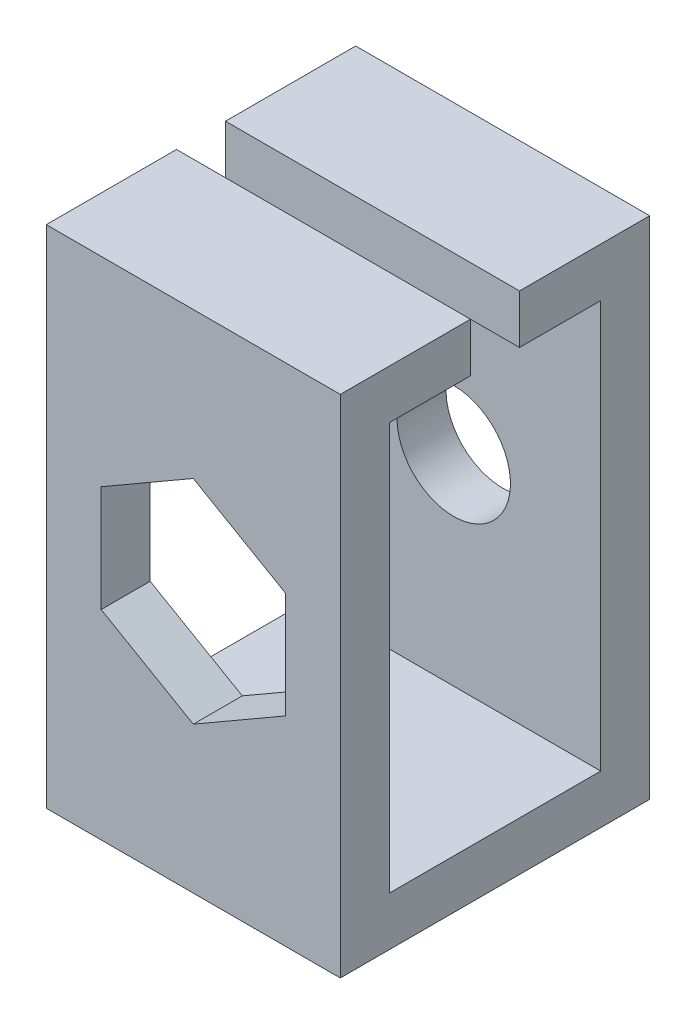
ISO-10303-21;
HEADER;
FILE_DESCRIPTION(('STEP AP214'),'2;1');
FILE_NAME('part.step','',(''),(''),'','','');
FILE_SCHEMA(('AUTOMOTIVE_DESIGN { 1 0 10303 214 1 1 1 1 }'));
ENDSEC;
DATA;
#1=APPLICATION_CONTEXT('core data for automotive mechanical design processes');
#2=APPLICATION_PROTOCOL_DEFINITION('international standard','automotive_design',2000,#1);
#3=PRODUCT_CONTEXT('',#1,'mechanical');
#4=PRODUCT('Part','Part','',(#3));
#5=PRODUCT_RELATED_PRODUCT_CATEGORY('part','',(#4));
#6=PRODUCT_DEFINITION_FORMATION('','',#4);
#7=PRODUCT_DEFINITION_CONTEXT('part definition',#1,'design');
#8=PRODUCT_DEFINITION('design','',#6,#7);
#9=PRODUCT_DEFINITION_SHAPE('','',#8);
#10=(LENGTH_UNIT() NAMED_UNIT(*) SI_UNIT(.MILLI.,.METRE.));
#11=(NAMED_UNIT(*) PLANE_ANGLE_UNIT() SI_UNIT($,.RADIAN.));
#12=(NAMED_UNIT(*) SI_UNIT($,.STERADIAN.) SOLID_ANGLE_UNIT());
#13=UNCERTAINTY_MEASURE_WITH_UNIT(LENGTH_MEASURE(1.E-05),#10,'distance_accuracy_value','');
#14=(GEOMETRIC_REPRESENTATION_CONTEXT(3) GLOBAL_UNCERTAINTY_ASSIGNED_CONTEXT((#13)) GLOBAL_UNIT_ASSIGNED_CONTEXT((#10,
#11,#12)) REPRESENTATION_CONTEXT('',''));
#15=CARTESIAN_POINT('',(0.,0.,0.));
#16=DIRECTION('',(0.,0.,1.));
#17=DIRECTION('',(1.,0.,0.));
#18=AXIS2_PLACEMENT_3D('',#15,#16,#17);
#19=CARTESIAN_POINT('',(9.525,13.2,6.85000000000001));
#20=DIRECTION('',(0.,1.,0.));
#21=DIRECTION('',(0.,0.,1.));
#22=AXIS2_PLACEMENT_3D('',#19,#20,#21);
#23=PLANE('',#22);
#24=DIRECTION('',(0.,0.,-1.));
#25=VECTOR('',#24,1.);
#26=CARTESIAN_POINT('',(-9.525,13.2,6.85000000000001));
#27=LINE('',#26,#25);
#28=CARTESIAN_POINT('',(-9.525,13.2,6.85000000000001));
#29=VERTEX_POINT('',#28);
#30=CARTESIAN_POINT('',(-9.525,13.2,1.5875));
#31=VERTEX_POINT('',#30);
#32=EDGE_CURVE('E209',#29,#31,#27,.T.);
#33=ORIENTED_EDGE('',*,*,#32,.T.);
#34=DIRECTION('',(-1.,0.,0.));
#35=VECTOR('',#34,1.);
#36=CARTESIAN_POINT('',(9.525,13.2,1.5875));
#37=LINE('',#36,#35);
#38=CARTESIAN_POINT('',(9.525,13.2,1.5875));
#39=VERTEX_POINT('',#38);
#40=EDGE_CURVE('E11',#39,#31,#37,.T.);
#41=ORIENTED_EDGE('',*,*,#40,.F.);
#42=DIRECTION('',(0.,0.,-1.));
#43=VECTOR('',#42,1.);
#44=CARTESIAN_POINT('',(9.525,13.2,6.85000000000001));
#45=LINE('',#44,#43);
#46=CARTESIAN_POINT('',(9.525,13.2,6.85000000000001));
#47=VERTEX_POINT('',#46);
#48=EDGE_CURVE('E210',#47,#39,#45,.T.);
#49=ORIENTED_EDGE('',*,*,#48,.F.);
#50=DIRECTION('',(-1.,0.,0.));
#51=VECTOR('',#50,1.);
#52=CARTESIAN_POINT('',(9.525,13.2,6.85000000000001));
#53=LINE('',#52,#51);
#54=EDGE_CURVE('E236',#47,#29,#53,.T.);
#55=ORIENTED_EDGE('',*,*,#54,.T.);
#56=EDGE_LOOP('',(#33,#41,#49,#55));
#57=FACE_BOUND('',#56,.T.);
#58=ADVANCED_FACE('F37',(#57),#23,.F.);
#59=CARTESIAN_POINT('',(9.525,13.2,1.5875));
#60=DIRECTION('',(0.,0.,1.));
#61=DIRECTION('',(0.,-1.,0.));
#62=AXIS2_PLACEMENT_3D('',#59,#60,#61);
#63=PLANE('',#62);
#64=DIRECTION('',(0.,1.,0.));
#65=VECTOR('',#64,1.);
#66=CARTESIAN_POINT('',(-9.525,13.2,1.5875));
#67=LINE('',#66,#65);
#68=CARTESIAN_POINT('',(-9.525,16.375,1.5875));
#69=VERTEX_POINT('',#68);
#70=EDGE_CURVE('E239',#31,#69,#67,.T.);
#71=ORIENTED_EDGE('',*,*,#70,.T.);
#72=DIRECTION('',(-1.,0.,0.));
#73=VECTOR('',#72,1.);
#74=CARTESIAN_POINT('',(9.525,16.375,1.5875));
#75=LINE('',#74,#73);
#76=CARTESIAN_POINT('',(9.525,16.375,1.5875));
#77=VERTEX_POINT('',#76);
#78=EDGE_CURVE('E44',#77,#69,#75,.T.);
#79=ORIENTED_EDGE('',*,*,#78,.F.);
#80=DIRECTION('',(0.,1.,0.));
#81=VECTOR('',#80,1.);
#82=CARTESIAN_POINT('',(9.525,13.2,1.5875));
#83=LINE('',#82,#81);
#84=EDGE_CURVE('E213',#39,#77,#83,.T.);
#85=ORIENTED_EDGE('',*,*,#84,.F.);
#86=ORIENTED_EDGE('',*,*,#40,.T.);
#87=EDGE_LOOP('',(#71,#79,#85,#86));
#88=FACE_BOUND('',#87,.T.);
#89=ADVANCED_FACE('F314',(#88),#63,.F.);
#90=CARTESIAN_POINT('',(9.525,16.375,1.5875));
#91=DIRECTION('',(0.,-1.,0.));
#92=DIRECTION('',(0.,0.,-1.));
#93=AXIS2_PLACEMENT_3D('',#90,#91,#92);
#94=PLANE('',#93);
#95=DIRECTION('',(0.,0.,1.));
#96=VECTOR('',#95,1.);
#97=CARTESIAN_POINT('',(-9.525,16.375,1.5875));
#98=LINE('',#97,#96);
#99=CARTESIAN_POINT('',(-9.525,16.375,10.025));
#100=VERTEX_POINT('',#99);
#101=EDGE_CURVE('E241',#69,#100,#98,.T.);
#102=ORIENTED_EDGE('',*,*,#101,.T.);
#103=DIRECTION('',(-1.,0.,0.));
#104=VECTOR('',#103,1.);
#105=CARTESIAN_POINT('',(9.525,16.375,10.025));
#106=LINE('',#105,#104);
#107=CARTESIAN_POINT('',(9.525,16.375,10.025));
#108=VERTEX_POINT('',#107);
#109=EDGE_CURVE('E286',#108,#100,#106,.T.);
#110=ORIENTED_EDGE('',*,*,#109,.F.);
#111=DIRECTION('',(0.,0.,1.));
#112=VECTOR('',#111,1.);
#113=CARTESIAN_POINT('',(9.525,16.375,1.5875));
#114=LINE('',#113,#112);
#115=EDGE_CURVE('E216',#77,#108,#114,.T.);
#116=ORIENTED_EDGE('',*,*,#115,.F.);
#117=ORIENTED_EDGE('',*,*,#78,.T.);
#118=EDGE_LOOP('',(#102,#110,#116,#117));
#119=FACE_BOUND('',#118,.T.);
#120=ADVANCED_FACE('F293',(#119),#94,.F.);
#121=CARTESIAN_POINT('',(9.525,16.375,10.025));
#122=DIRECTION('',(0.,0.,-1.));
#123=DIRECTION('',(0.,1.,0.));
#124=AXIS2_PLACEMENT_3D('',#121,#122,#123);
#125=PLANE('',#124);
#126=DIRECTION('',(-0.866025403784439,-0.5,0.));
#127=VECTOR('',#126,1.);
#128=CARTESIAN_POINT('',(0.,6.89240751358575,10.025));
#129=LINE('',#128,#127);
#130=CARTESIAN_POINT('',(0.,6.89240751358575,10.025));
#131=VERTEX_POINT('',#130);
#132=CARTESIAN_POINT('',(-5.969,3.44620375679288,10.025));
#133=VERTEX_POINT('',#132);
#134=EDGE_CURVE('E173',#131,#133,#129,.T.);
#135=ORIENTED_EDGE('',*,*,#134,.F.);
#136=DIRECTION('',(-0.866025403784438,0.5,0.));
#137=VECTOR('',#136,1.);
#138=CARTESIAN_POINT('',(5.969,3.44620375679288,10.025));
#139=LINE('',#138,#137);
#140=CARTESIAN_POINT('',(5.969,3.44620375679288,10.025));
#141=VERTEX_POINT('',#140);
#142=EDGE_CURVE('E51',#141,#131,#139,.T.);
#143=ORIENTED_EDGE('',*,*,#142,.F.);
#144=DIRECTION('',(0.,1.,0.));
#145=VECTOR('',#144,1.);
#146=CARTESIAN_POINT('',(5.969,-3.44620375679288,10.025));
#147=LINE('',#146,#145);
#148=CARTESIAN_POINT('',(5.969,-3.44620375679288,10.025));
#149=VERTEX_POINT('',#148);
#150=EDGE_CURVE('E189',#149,#141,#147,.T.);
#151=ORIENTED_EDGE('',*,*,#150,.F.);
#152=DIRECTION('',(0.866025403784439,0.5,0.));
#153=VECTOR('',#152,1.);
#154=CARTESIAN_POINT('',(0.,-6.89240751358575,10.025));
#155=LINE('',#154,#153);
#156=CARTESIAN_POINT('',(0.,-6.89240751358575,10.025));
#157=VERTEX_POINT('',#156);
#158=EDGE_CURVE('E183',#157,#149,#155,.T.);
#159=ORIENTED_EDGE('',*,*,#158,.F.);
#160=DIRECTION('',(0.866025403784439,-0.5,0.));
#161=VECTOR('',#160,1.);
#162=CARTESIAN_POINT('',(-5.969,-3.44620375679287,10.025));
#163=LINE('',#162,#161);
#164=CARTESIAN_POINT('',(-5.969,-3.44620375679287,10.025));
#165=VERTEX_POINT('',#164);
#166=EDGE_CURVE('E181',#165,#157,#163,.T.);
#167=ORIENTED_EDGE('',*,*,#166,.F.);
#168=DIRECTION('',(0.,-1.,0.));
#169=VECTOR('',#168,1.);
#170=CARTESIAN_POINT('',(-5.969,3.44620375679288,10.025));
#171=LINE('',#170,#169);
#172=EDGE_CURVE('E164',#133,#165,#171,.T.);
#173=ORIENTED_EDGE('',*,*,#172,.F.);
#174=EDGE_LOOP('',(#135,#143,#151,#159,#167,#173));
#175=FACE_BOUND('',#174,.T.);
#176=DIRECTION('',(0.,-1.,0.));
#177=VECTOR('',#176,1.);
#178=CARTESIAN_POINT('',(-9.525,16.375,10.025));
#179=LINE('',#178,#177);
#180=CARTESIAN_POINT('',(-9.525,-16.375,10.025));
#181=VERTEX_POINT('',#180);
#182=EDGE_CURVE('E243',#100,#181,#179,.T.);
#183=ORIENTED_EDGE('',*,*,#182,.T.);
#184=DIRECTION('',(-1.,0.,0.));
#185=VECTOR('',#184,1.);
#186=CARTESIAN_POINT('',(9.525,-16.375,10.025));
#187=LINE('',#186,#185);
#188=CARTESIAN_POINT('',(9.525,-16.375,10.025));
#189=VERTEX_POINT('',#188);
#190=EDGE_CURVE('E283',#189,#181,#187,.T.);
#191=ORIENTED_EDGE('',*,*,#190,.F.);
#192=DIRECTION('',(0.,-1.,0.));
#193=VECTOR('',#192,1.);
#194=CARTESIAN_POINT('',(9.525,16.375,10.025));
#195=LINE('',#194,#193);
#196=EDGE_CURVE('E218',#108,#189,#195,.T.);
#197=ORIENTED_EDGE('',*,*,#196,.F.);
#198=ORIENTED_EDGE('',*,*,#109,.T.);
#199=EDGE_LOOP('',(#183,#191,#197,#198));
#200=FACE_BOUND('',#199,.T.);
#201=ADVANCED_FACE('F177',(#175,#200),#125,.F.);
#202=CARTESIAN_POINT('',(9.525,-16.375,10.025));
#203=DIRECTION('',(0.,1.,0.));
#204=DIRECTION('',(0.,0.,1.));
#205=AXIS2_PLACEMENT_3D('',#202,#203,#204);
#206=PLANE('',#205);
#207=DIRECTION('',(0.,0.,-1.));
#208=VECTOR('',#207,1.);
#209=CARTESIAN_POINT('',(-9.525,-16.375,10.025));
#210=LINE('',#209,#208);
#211=CARTESIAN_POINT('',(-9.525,-16.375,-10.025));
#212=VERTEX_POINT('',#211);
#213=EDGE_CURVE('E245',#181,#212,#210,.T.);
#214=ORIENTED_EDGE('',*,*,#213,.T.);
#215=DIRECTION('',(-1.,0.,0.));
#216=VECTOR('',#215,1.);
#217=CARTESIAN_POINT('',(9.525,-16.375,-10.025));
#218=LINE('',#217,#216);
#219=CARTESIAN_POINT('',(9.525,-16.375,-10.025));
#220=VERTEX_POINT('',#219);
#221=EDGE_CURVE('E280',#220,#212,#218,.T.);
#222=ORIENTED_EDGE('',*,*,#221,.F.);
#223=DIRECTION('',(0.,0.,-1.));
#224=VECTOR('',#223,1.);
#225=CARTESIAN_POINT('',(9.525,-16.375,10.025));
#226=LINE('',#225,#224);
#227=EDGE_CURVE('E220',#189,#220,#226,.T.);
#228=ORIENTED_EDGE('',*,*,#227,.F.);
#229=ORIENTED_EDGE('',*,*,#190,.T.);
#230=EDGE_LOOP('',(#214,#222,#228,#229));
#231=FACE_BOUND('',#230,.T.);
#232=ADVANCED_FACE('F306',(#231),#206,.F.);
#233=CARTESIAN_POINT('',(9.525,-16.375,-10.025));
#234=DIRECTION('',(0.,0.,1.));
#235=DIRECTION('',(0.,-1.,0.));
#236=AXIS2_PLACEMENT_3D('',#233,#234,#235);
#237=PLANE('',#236);
#238=CARTESIAN_POINT('',(0.,0.,-10.025));
#239=DIRECTION('',(0.,0.,-1.));
#240=DIRECTION('',(0.,1.,0.));
#241=AXIS2_PLACEMENT_3D('',#238,#239,#240);
#242=CIRCLE('',#241,3.675);
#243=CARTESIAN_POINT('',(0.,3.675,-10.025));
#244=VERTEX_POINT('',#243);
#245=EDGE_CURVE('E202',#244,#244,#242,.T.);
#246=ORIENTED_EDGE('',*,*,#245,.F.);
#247=EDGE_LOOP('',(#246));
#248=FACE_BOUND('',#247,.T.);
#249=DIRECTION('',(0.,1.,0.));
#250=VECTOR('',#249,1.);
#251=CARTESIAN_POINT('',(-9.525,-16.375,-10.025));
#252=LINE('',#251,#250);
#253=CARTESIAN_POINT('',(-9.525,16.375,-10.025));
#254=VERTEX_POINT('',#253);
#255=EDGE_CURVE('E247',#212,#254,#252,.T.);
#256=ORIENTED_EDGE('',*,*,#255,.T.);
#257=DIRECTION('',(-1.,0.,0.));
#258=VECTOR('',#257,1.);
#259=CARTESIAN_POINT('',(9.525,16.375,-10.025));
#260=LINE('',#259,#258);
#261=CARTESIAN_POINT('',(9.525,16.375,-10.025));
#262=VERTEX_POINT('',#261);
#263=EDGE_CURVE('E277',#262,#254,#260,.T.);
#264=ORIENTED_EDGE('',*,*,#263,.F.);
#265=DIRECTION('',(0.,1.,0.));
#266=VECTOR('',#265,1.);
#267=CARTESIAN_POINT('',(9.525,-16.375,-10.025));
#268=LINE('',#267,#266);
#269=EDGE_CURVE('E222',#220,#262,#268,.T.);
#270=ORIENTED_EDGE('',*,*,#269,.F.);
#271=ORIENTED_EDGE('',*,*,#221,.T.);
#272=EDGE_LOOP('',(#256,#264,#270,#271));
#273=FACE_BOUND('',#272,.T.);
#274=ADVANCED_FACE('F347',(#248,#273),#237,.F.);
#275=CARTESIAN_POINT('',(9.525,16.375,-10.025));
#276=DIRECTION('',(0.,-1.,0.));
#277=DIRECTION('',(0.,0.,-1.));
#278=AXIS2_PLACEMENT_3D('',#275,#276,#277);
#279=PLANE('',#278);
#280=DIRECTION('',(0.,0.,1.));
#281=VECTOR('',#280,1.);
#282=CARTESIAN_POINT('',(-9.525,16.375,-10.025));
#283=LINE('',#282,#281);
#284=CARTESIAN_POINT('',(-9.525,16.375,-1.5875));
#285=VERTEX_POINT('',#284);
#286=EDGE_CURVE('E249',#254,#285,#283,.T.);
#287=ORIENTED_EDGE('',*,*,#286,.T.);
#288=DIRECTION('',(-1.,0.,0.));
#289=VECTOR('',#288,1.);
#290=CARTESIAN_POINT('',(9.525,16.375,-1.5875));
#291=LINE('',#290,#289);
#292=CARTESIAN_POINT('',(9.525,16.375,-1.5875));
#293=VERTEX_POINT('',#292);
#294=EDGE_CURVE('E274',#293,#285,#291,.T.);
#295=ORIENTED_EDGE('',*,*,#294,.F.);
#296=DIRECTION('',(0.,0.,1.));
#297=VECTOR('',#296,1.);
#298=CARTESIAN_POINT('',(9.525,16.375,-10.025));
#299=LINE('',#298,#297);
#300=EDGE_CURVE('E224',#262,#293,#299,.T.);
#301=ORIENTED_EDGE('',*,*,#300,.F.);
#302=ORIENTED_EDGE('',*,*,#263,.T.);
#303=EDGE_LOOP('',(#287,#295,#301,#302));
#304=FACE_BOUND('',#303,.T.);
#305=ADVANCED_FACE('F345',(#304),#279,.F.);
#306=CARTESIAN_POINT('',(9.525,16.375,-1.5875));
#307=DIRECTION('',(0.,0.,-1.));
#308=DIRECTION('',(0.,1.,0.));
#309=AXIS2_PLACEMENT_3D('',#306,#307,#308);
#310=PLANE('',#309);
#311=DIRECTION('',(0.,-1.,0.));
#312=VECTOR('',#311,1.);
#313=CARTESIAN_POINT('',(-9.525,16.375,-1.5875));
#314=LINE('',#313,#312);
#315=CARTESIAN_POINT('',(-9.525,13.2,-1.5875));
#316=VERTEX_POINT('',#315);
#317=EDGE_CURVE('E251',#285,#316,#314,.T.);
#318=ORIENTED_EDGE('',*,*,#317,.T.);
#319=DIRECTION('',(-1.,0.,0.));
#320=VECTOR('',#319,1.);
#321=CARTESIAN_POINT('',(9.525,13.2,-1.5875));
#322=LINE('',#321,#320);
#323=CARTESIAN_POINT('',(9.525,13.2,-1.5875));
#324=VERTEX_POINT('',#323);
#325=EDGE_CURVE('E271',#324,#316,#322,.T.);
#326=ORIENTED_EDGE('',*,*,#325,.F.);
#327=DIRECTION('',(0.,-1.,0.));
#328=VECTOR('',#327,1.);
#329=CARTESIAN_POINT('',(9.525,16.375,-1.5875));
#330=LINE('',#329,#328);
#331=EDGE_CURVE('E226',#293,#324,#330,.T.);
#332=ORIENTED_EDGE('',*,*,#331,.F.);
#333=ORIENTED_EDGE('',*,*,#294,.T.);
#334=EDGE_LOOP('',(#318,#326,#332,#333));
#335=FACE_BOUND('',#334,.T.);
#336=ADVANCED_FACE('F341',(#335),#310,.F.);
#337=CARTESIAN_POINT('',(9.525,13.2,-1.5875));
#338=DIRECTION('',(0.,1.,0.));
#339=DIRECTION('',(0.,0.,1.));
#340=AXIS2_PLACEMENT_3D('',#337,#338,#339);
#341=PLANE('',#340);
#342=DIRECTION('',(0.,0.,-1.));
#343=VECTOR('',#342,1.);
#344=CARTESIAN_POINT('',(-9.525,13.2,-1.5875));
#345=LINE('',#344,#343);
#346=CARTESIAN_POINT('',(-9.525,13.2,-6.85));
#347=VERTEX_POINT('',#346);
#348=EDGE_CURVE('E253',#316,#347,#345,.T.);
#349=ORIENTED_EDGE('',*,*,#348,.T.);
#350=DIRECTION('',(-1.,0.,0.));
#351=VECTOR('',#350,1.);
#352=CARTESIAN_POINT('',(9.525,13.2,-6.85));
#353=LINE('',#352,#351);
#354=CARTESIAN_POINT('',(9.525,13.2,-6.85));
#355=VERTEX_POINT('',#354);
#356=EDGE_CURVE('E268',#355,#347,#353,.T.);
#357=ORIENTED_EDGE('',*,*,#356,.F.);
#358=DIRECTION('',(0.,0.,-1.));
#359=VECTOR('',#358,1.);
#360=CARTESIAN_POINT('',(9.525,13.2,-1.5875));
#361=LINE('',#360,#359);
#362=EDGE_CURVE('E228',#324,#355,#361,.T.);
#363=ORIENTED_EDGE('',*,*,#362,.F.);
#364=ORIENTED_EDGE('',*,*,#325,.T.);
#365=EDGE_LOOP('',(#349,#357,#363,#364));
#366=FACE_BOUND('',#365,.T.);
#367=ADVANCED_FACE('F336',(#366),#341,.F.);
#368=CARTESIAN_POINT('',(9.525,13.2,-6.85));
#369=DIRECTION('',(0.,0.,-1.));
#370=DIRECTION('',(-1.,0.,0.));
#371=AXIS2_PLACEMENT_3D('',#368,#369,#370);
#372=PLANE('',#371);
#373=CARTESIAN_POINT('',(0.,0.,-6.85));
#374=DIRECTION('',(0.,0.,-1.));
#375=DIRECTION('',(-1.,0.,0.));
#376=AXIS2_PLACEMENT_3D('',#373,#374,#375);
#377=CIRCLE('',#376,3.675);
#378=CARTESIAN_POINT('',(-3.675,0.,-6.85));
#379=VERTEX_POINT('',#378);
#380=EDGE_CURVE('E206',#379,#379,#377,.T.);
#381=ORIENTED_EDGE('',*,*,#380,.T.);
#382=EDGE_LOOP('',(#381));
#383=FACE_BOUND('',#382,.T.);
#384=DIRECTION('',(0.,-1.,0.));
#385=VECTOR('',#384,1.);
#386=CARTESIAN_POINT('',(-9.525,13.2,-6.85));
#387=LINE('',#386,#385);
#388=CARTESIAN_POINT('',(-9.525,-13.2,-6.85));
#389=VERTEX_POINT('',#388);
#390=EDGE_CURVE('E255',#347,#389,#387,.T.);
#391=ORIENTED_EDGE('',*,*,#390,.T.);
#392=DIRECTION('',(-1.,0.,0.));
#393=VECTOR('',#392,1.);
#394=CARTESIAN_POINT('',(9.525,-13.2,-6.85));
#395=LINE('',#394,#393);
#396=CARTESIAN_POINT('',(9.525,-13.2,-6.85));
#397=VERTEX_POINT('',#396);
#398=EDGE_CURVE('E265',#397,#389,#395,.T.);
#399=ORIENTED_EDGE('',*,*,#398,.F.);
#400=DIRECTION('',(0.,-1.,0.));
#401=VECTOR('',#400,1.);
#402=CARTESIAN_POINT('',(9.525,13.2,-6.85));
#403=LINE('',#402,#401);
#404=EDGE_CURVE('E230',#355,#397,#403,.T.);
#405=ORIENTED_EDGE('',*,*,#404,.F.);
#406=ORIENTED_EDGE('',*,*,#356,.T.);
#407=EDGE_LOOP('',(#391,#399,#405,#406));
#408=FACE_BOUND('',#407,.T.);
#409=ADVANCED_FACE('F330',(#383,#408),#372,.F.);
#410=CARTESIAN_POINT('',(9.525,-13.2,-6.85));
#411=DIRECTION('',(0.,-1.,0.));
#412=DIRECTION('',(0.,0.,-1.));
#413=AXIS2_PLACEMENT_3D('',#410,#411,#412);
#414=PLANE('',#413);
#415=DIRECTION('',(0.,0.,1.));
#416=VECTOR('',#415,1.);
#417=CARTESIAN_POINT('',(-9.525,-13.2,-6.85));
#418=LINE('',#417,#416);
#419=CARTESIAN_POINT('',(-9.525,-13.2,6.85));
#420=VERTEX_POINT('',#419);
#421=EDGE_CURVE('E257',#389,#420,#418,.T.);
#422=ORIENTED_EDGE('',*,*,#421,.T.);
#423=DIRECTION('',(-1.,0.,0.));
#424=VECTOR('',#423,1.);
#425=CARTESIAN_POINT('',(9.525,-13.2,6.85));
#426=LINE('',#425,#424);
#427=CARTESIAN_POINT('',(9.525,-13.2,6.85));
#428=VERTEX_POINT('',#427);
#429=EDGE_CURVE('E262',#428,#420,#426,.T.);
#430=ORIENTED_EDGE('',*,*,#429,.F.);
#431=DIRECTION('',(0.,0.,1.));
#432=VECTOR('',#431,1.);
#433=CARTESIAN_POINT('',(9.525,-13.2,-6.85));
#434=LINE('',#433,#432);
#435=EDGE_CURVE('E232',#397,#428,#434,.T.);
#436=ORIENTED_EDGE('',*,*,#435,.F.);
#437=ORIENTED_EDGE('',*,*,#398,.T.);
#438=EDGE_LOOP('',(#422,#430,#436,#437));
#439=FACE_BOUND('',#438,.T.);
#440=ADVANCED_FACE('F326',(#439),#414,.F.);
#441=CARTESIAN_POINT('',(9.525,-13.2,6.85));
#442=DIRECTION('',(0.,0.,1.));
#443=DIRECTION('',(0.,-1.,0.));
#444=AXIS2_PLACEMENT_3D('',#441,#442,#443);
#445=PLANE('',#444);
#446=DIRECTION('',(0.,-1.,0.));
#447=VECTOR('',#446,1.);
#448=CARTESIAN_POINT('',(5.969,-3.44620375679288,6.85));
#449=LINE('',#448,#447);
#450=CARTESIAN_POINT('',(5.969,3.44620375679288,6.85));
#451=VERTEX_POINT('',#450);
#452=CARTESIAN_POINT('',(5.969,-3.44620375679288,6.85));
#453=VERTEX_POINT('',#452);
#454=EDGE_CURVE('E515',#451,#453,#449,.T.);
#455=ORIENTED_EDGE('',*,*,#454,.F.);
#456=DIRECTION('',(0.866025403784438,-0.5,0.));
#457=VECTOR('',#456,1.);
#458=CARTESIAN_POINT('',(5.969,3.44620375679287,6.85));
#459=LINE('',#458,#457);
#460=CARTESIAN_POINT('',(0.,6.89240751358575,6.85000000000001));
#461=VERTEX_POINT('',#460);
#462=EDGE_CURVE('E203',#461,#451,#459,.T.);
#463=ORIENTED_EDGE('',*,*,#462,.F.);
#464=DIRECTION('',(0.866025403784439,0.5,0.));
#465=VECTOR('',#464,1.);
#466=CARTESIAN_POINT('',(0.,6.89240751358575,6.85000000000001));
#467=LINE('',#466,#465);
#468=CARTESIAN_POINT('',(-5.969,3.44620375679289,6.85));
#469=VERTEX_POINT('',#468);
#470=EDGE_CURVE('E200',#469,#461,#467,.T.);
#471=ORIENTED_EDGE('',*,*,#470,.F.);
#472=DIRECTION('',(0.,1.,0.));
#473=VECTOR('',#472,1.);
#474=CARTESIAN_POINT('',(-5.969,3.44620375679288,6.85));
#475=LINE('',#474,#473);
#476=CARTESIAN_POINT('',(-5.969,-3.44620375679287,6.85));
#477=VERTEX_POINT('',#476);
#478=EDGE_CURVE('E167',#477,#469,#475,.T.);
#479=ORIENTED_EDGE('',*,*,#478,.F.);
#480=DIRECTION('',(-0.866025403784439,0.5,0.));
#481=VECTOR('',#480,1.);
#482=CARTESIAN_POINT('',(-5.969,-3.44620375679288,6.85));
#483=LINE('',#482,#481);
#484=CARTESIAN_POINT('',(0.,-6.89240751358575,6.85));
#485=VERTEX_POINT('',#484);
#486=EDGE_CURVE('E522',#485,#477,#483,.T.);
#487=ORIENTED_EDGE('',*,*,#486,.F.);
#488=DIRECTION('',(-0.866025403784439,-0.5,0.));
#489=VECTOR('',#488,1.);
#490=CARTESIAN_POINT('',(0.,-6.89240751358575,6.85));
#491=LINE('',#490,#489);
#492=EDGE_CURVE('E517',#453,#485,#491,.T.);
#493=ORIENTED_EDGE('',*,*,#492,.F.);
#494=EDGE_LOOP('',(#455,#463,#471,#479,#487,#493));
#495=FACE_BOUND('',#494,.T.);
#496=DIRECTION('',(0.,1.,0.));
#497=VECTOR('',#496,1.);
#498=CARTESIAN_POINT('',(-9.525,-13.2,6.85));
#499=LINE('',#498,#497);
#500=EDGE_CURVE('E214',#420,#29,#499,.T.);
#501=ORIENTED_EDGE('',*,*,#500,.T.);
#502=ORIENTED_EDGE('',*,*,#54,.F.);
#503=DIRECTION('',(0.,1.,0.));
#504=VECTOR('',#503,1.);
#505=CARTESIAN_POINT('',(9.525,-13.2,6.85));
#506=LINE('',#505,#504);
#507=EDGE_CURVE('E234',#428,#47,#506,.T.);
#508=ORIENTED_EDGE('',*,*,#507,.F.);
#509=ORIENTED_EDGE('',*,*,#429,.T.);
#510=EDGE_LOOP('',(#501,#502,#508,#509));
#511=FACE_BOUND('',#510,.T.);
#512=ADVANCED_FACE('F321',(#495,#511),#445,.F.);
#513=CARTESIAN_POINT('',(9.525,0.,0.));
#514=DIRECTION('',(1.,0.,0.));
#515=DIRECTION('',(0.,0.,-1.));
#516=AXIS2_PLACEMENT_3D('',#513,#514,#515);
#517=PLANE('',#516);
#518=ORIENTED_EDGE('',*,*,#48,.T.);
#519=ORIENTED_EDGE('',*,*,#84,.T.);
#520=ORIENTED_EDGE('',*,*,#115,.T.);
#521=ORIENTED_EDGE('',*,*,#196,.T.);
#522=ORIENTED_EDGE('',*,*,#227,.T.);
#523=ORIENTED_EDGE('',*,*,#269,.T.);
#524=ORIENTED_EDGE('',*,*,#300,.T.);
#525=ORIENTED_EDGE('',*,*,#331,.T.);
#526=ORIENTED_EDGE('',*,*,#362,.T.);
#527=ORIENTED_EDGE('',*,*,#404,.T.);
#528=ORIENTED_EDGE('',*,*,#435,.T.);
#529=ORIENTED_EDGE('',*,*,#507,.T.);
#530=EDGE_LOOP('',(#518,#519,#520,#521,#522,#523,#524,#525,#526,#527,#528,#529));
#531=FACE_BOUND('',#530,.T.);
#532=ADVANCED_FACE('F310',(#531),#517,.T.);
#533=CARTESIAN_POINT('',(-9.525,0.,0.));
#534=DIRECTION('',(1.,0.,0.));
#535=DIRECTION('',(0.,0.,-1.));
#536=AXIS2_PLACEMENT_3D('',#533,#534,#535);
#537=PLANE('',#536);
#538=ORIENTED_EDGE('',*,*,#32,.F.);
#539=ORIENTED_EDGE('',*,*,#500,.F.);
#540=ORIENTED_EDGE('',*,*,#421,.F.);
#541=ORIENTED_EDGE('',*,*,#390,.F.);
#542=ORIENTED_EDGE('',*,*,#348,.F.);
#543=ORIENTED_EDGE('',*,*,#317,.F.);
#544=ORIENTED_EDGE('',*,*,#286,.F.);
#545=ORIENTED_EDGE('',*,*,#255,.F.);
#546=ORIENTED_EDGE('',*,*,#213,.F.);
#547=ORIENTED_EDGE('',*,*,#182,.F.);
#548=ORIENTED_EDGE('',*,*,#101,.F.);
#549=ORIENTED_EDGE('',*,*,#70,.F.);
#550=EDGE_LOOP('',(#538,#539,#540,#541,#542,#543,#544,#545,#546,#547,#548,#549));
#551=FACE_BOUND('',#550,.T.);
#552=ADVANCED_FACE('F299',(#551),#537,.F.);
#553=CARTESIAN_POINT('',(0.,0.,10.025));
#554=DIRECTION('',(0.,0.,-1.));
#555=DIRECTION('',(0.,1.,0.));
#556=AXIS2_PLACEMENT_3D('',#553,#554,#555);
#557=CYLINDRICAL_SURFACE('',#556,3.675);
#558=ORIENTED_EDGE('',*,*,#245,.T.);
#559=EDGE_LOOP('',(#558));
#560=FACE_BOUND('',#559,.T.);
#561=ORIENTED_EDGE('',*,*,#380,.F.);
#562=EDGE_LOOP('',(#561));
#563=FACE_BOUND('',#562,.T.);
#564=ADVANCED_FACE('F431',(#560,#563),#557,.F.);
#565=CARTESIAN_POINT('',(5.969,3.44620375679288,-11.3855962154609));
#566=DIRECTION('',(0.5,0.866025403784438,0.));
#567=DIRECTION('',(-0.866025403784439,0.5,0.));
#568=AXIS2_PLACEMENT_3D('',#565,#566,#567);
#569=PLANE('',#568);
#570=ORIENTED_EDGE('',*,*,#462,.T.);
#571=DIRECTION('',(0.,0.,1.));
#572=VECTOR('',#571,1.);
#573=CARTESIAN_POINT('',(5.969,3.44620375679288,-11.3855962154609));
#574=LINE('',#573,#572);
#575=EDGE_CURVE('E192',#451,#141,#574,.T.);
#576=ORIENTED_EDGE('',*,*,#575,.T.);
#577=ORIENTED_EDGE('',*,*,#142,.T.);
#578=DIRECTION('',(0.,0.,1.));
#579=VECTOR('',#578,1.);
#580=CARTESIAN_POINT('',(0.,6.89240751358575,-11.3855962154609));
#581=LINE('',#580,#579);
#582=EDGE_CURVE('E170',#461,#131,#581,.T.);
#583=ORIENTED_EDGE('',*,*,#582,.F.);
#584=EDGE_LOOP('',(#570,#576,#577,#583));
#585=FACE_BOUND('',#584,.T.);
#586=ADVANCED_FACE('F449',(#585),#569,.F.);
#587=CARTESIAN_POINT('',(5.969,-3.44620375679288,-11.3855962154609));
#588=DIRECTION('',(1.,0.,0.));
#589=DIRECTION('',(0.,1.,0.));
#590=AXIS2_PLACEMENT_3D('',#587,#588,#589);
#591=PLANE('',#590);
#592=ORIENTED_EDGE('',*,*,#454,.T.);
#593=DIRECTION('',(0.,0.,1.));
#594=VECTOR('',#593,1.);
#595=CARTESIAN_POINT('',(5.969,-3.44620375679288,-11.3855962154609));
#596=LINE('',#595,#594);
#597=EDGE_CURVE('E194',#453,#149,#596,.T.);
#598=ORIENTED_EDGE('',*,*,#597,.T.);
#599=ORIENTED_EDGE('',*,*,#150,.T.);
#600=ORIENTED_EDGE('',*,*,#575,.F.);
#601=EDGE_LOOP('',(#592,#598,#599,#600));
#602=FACE_BOUND('',#601,.T.);
#603=ADVANCED_FACE('F460',(#602),#591,.F.);
#604=CARTESIAN_POINT('',(0.,-6.89240751358575,-11.3855962154609));
#605=DIRECTION('',(0.5,-0.866025403784439,0.));
#606=DIRECTION('',(0.866025403784439,0.5,0.));
#607=AXIS2_PLACEMENT_3D('',#604,#605,#606);
#608=PLANE('',#607);
#609=ORIENTED_EDGE('',*,*,#492,.T.);
#610=DIRECTION('',(0.,0.,1.));
#611=VECTOR('',#610,1.);
#612=CARTESIAN_POINT('',(0.,-6.89240751358575,-11.3855962154609));
#613=LINE('',#612,#611);
#614=EDGE_CURVE('E196',#485,#157,#613,.T.);
#615=ORIENTED_EDGE('',*,*,#614,.T.);
#616=ORIENTED_EDGE('',*,*,#158,.T.);
#617=ORIENTED_EDGE('',*,*,#597,.F.);
#618=EDGE_LOOP('',(#609,#615,#616,#617));
#619=FACE_BOUND('',#618,.T.);
#620=ADVANCED_FACE('F466',(#619),#608,.F.);
#621=CARTESIAN_POINT('',(-5.969,-3.44620375679287,-11.3855962154609));
#622=DIRECTION('',(-0.5,-0.866025403784439,0.));
#623=DIRECTION('',(0.866025403784439,-0.5,0.));
#624=AXIS2_PLACEMENT_3D('',#621,#622,#623);
#625=PLANE('',#624);
#626=ORIENTED_EDGE('',*,*,#486,.T.);
#627=DIRECTION('',(0.,0.,1.));
#628=VECTOR('',#627,1.);
#629=CARTESIAN_POINT('',(-5.969,-3.44620375679287,-11.3855962154609));
#630=LINE('',#629,#628);
#631=EDGE_CURVE('E169',#477,#165,#630,.T.);
#632=ORIENTED_EDGE('',*,*,#631,.T.);
#633=ORIENTED_EDGE('',*,*,#166,.T.);
#634=ORIENTED_EDGE('',*,*,#614,.F.);
#635=EDGE_LOOP('',(#626,#632,#633,#634));
#636=FACE_BOUND('',#635,.T.);
#637=ADVANCED_FACE('F474',(#636),#625,.F.);
#638=CARTESIAN_POINT('',(-5.969,3.44620375679288,-11.3855962154609));
#639=DIRECTION('',(-1.,0.,0.));
#640=DIRECTION('',(0.,0.,1.));
#641=AXIS2_PLACEMENT_3D('',#638,#639,#640);
#642=PLANE('',#641);
#643=ORIENTED_EDGE('',*,*,#478,.T.);
#644=DIRECTION('',(0.,0.,1.));
#645=VECTOR('',#644,1.);
#646=CARTESIAN_POINT('',(-5.969,3.44620375679288,-11.3855962154609));
#647=LINE('',#646,#645);
#648=EDGE_CURVE('E59',#469,#133,#647,.T.);
#649=ORIENTED_EDGE('',*,*,#648,.T.);
#650=ORIENTED_EDGE('',*,*,#172,.T.);
#651=ORIENTED_EDGE('',*,*,#631,.F.);
#652=EDGE_LOOP('',(#643,#649,#650,#651));
#653=FACE_BOUND('',#652,.T.);
#654=ADVANCED_FACE('F161',(#653),#642,.F.);
#655=CARTESIAN_POINT('',(0.,6.89240751358575,-11.3855962154609));
#656=DIRECTION('',(-0.499999999999999,0.866025403784439,0.));
#657=DIRECTION('',(-0.866025403784439,-0.499999999999999,0.));
#658=AXIS2_PLACEMENT_3D('',#655,#656,#657);
#659=PLANE('',#658);
#660=ORIENTED_EDGE('',*,*,#470,.T.);
#661=ORIENTED_EDGE('',*,*,#582,.T.);
#662=ORIENTED_EDGE('',*,*,#134,.T.);
#663=ORIENTED_EDGE('',*,*,#648,.F.);
#664=EDGE_LOOP('',(#660,#661,#662,#663));
#665=FACE_BOUND('',#664,.T.);
#666=ADVANCED_FACE('F174',(#665),#659,.F.);
#667=CLOSED_SHELL('',(#58,#89,#120,#201,#232,#274,#305,#336,#367,#409,#440,#512,#532,#552,#564,
#586,#603,#620,#637,#654,#666));
#668=MANIFOLD_SOLID_BREP('B2',#667);
#669=ADVANCED_BREP_SHAPE_REPRESENTATION('',(#18,#668),#14);
#670=SHAPE_DEFINITION_REPRESENTATION(#9,#669);
ENDSEC;
END-ISO-10303-21;
